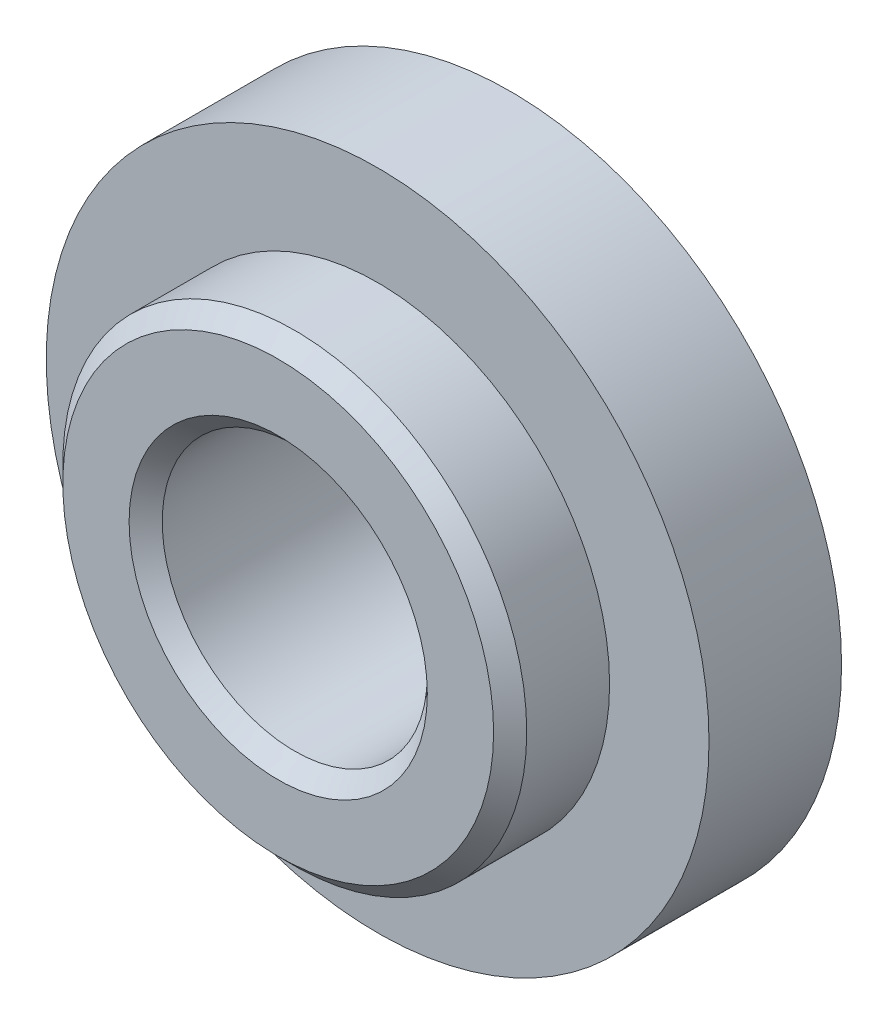
ISO-10303-21;
HEADER;
FILE_DESCRIPTION(('STEP AP214'),'2;1');
FILE_NAME('part.step','',(''),(''),'','','');
FILE_SCHEMA(('AUTOMOTIVE_DESIGN { 1 0 10303 214 1 1 1 1 }'));
ENDSEC;
DATA;
#1=APPLICATION_CONTEXT('core data for automotive mechanical design processes');
#2=APPLICATION_PROTOCOL_DEFINITION('international standard','automotive_design',2000,#1);
#3=PRODUCT_CONTEXT('',#1,'mechanical');
#4=PRODUCT('Part','Part','',(#3));
#5=PRODUCT_RELATED_PRODUCT_CATEGORY('part','',(#4));
#6=PRODUCT_DEFINITION_FORMATION('','',#4);
#7=PRODUCT_DEFINITION_CONTEXT('part definition',#1,'design');
#8=PRODUCT_DEFINITION('design','',#6,#7);
#9=PRODUCT_DEFINITION_SHAPE('','',#8);
#10=(LENGTH_UNIT() NAMED_UNIT(*) SI_UNIT(.MILLI.,.METRE.));
#11=(NAMED_UNIT(*) PLANE_ANGLE_UNIT() SI_UNIT($,.RADIAN.));
#12=(NAMED_UNIT(*) SI_UNIT($,.STERADIAN.) SOLID_ANGLE_UNIT());
#13=UNCERTAINTY_MEASURE_WITH_UNIT(LENGTH_MEASURE(1.E-05),#10,'distance_accuracy_value','');
#14=(GEOMETRIC_REPRESENTATION_CONTEXT(3) GLOBAL_UNCERTAINTY_ASSIGNED_CONTEXT((#13)) GLOBAL_UNIT_ASSIGNED_CONTEXT((#10,
#11,#12)) REPRESENTATION_CONTEXT('',''));
#15=CARTESIAN_POINT('',(0.,0.,0.));
#16=DIRECTION('',(0.,0.,1.));
#17=DIRECTION('',(1.,0.,0.));
#18=AXIS2_PLACEMENT_3D('',#15,#16,#17);
#19=CARTESIAN_POINT('',(0.,0.,4.));
#20=DIRECTION('',(0.,0.,1.));
#21=DIRECTION('',(1.,0.,0.));
#22=AXIS2_PLACEMENT_3D('',#19,#20,#21);
#23=PLANE('',#22);
#24=CARTESIAN_POINT('',(0.,0.,4.));
#25=DIRECTION('',(0.,0.,1.));
#26=DIRECTION('',(1.,0.,0.));
#27=AXIS2_PLACEMENT_3D('',#24,#25,#26);
#28=CIRCLE('',#27,7.);
#29=CARTESIAN_POINT('',(7.,0.,4.));
#30=VERTEX_POINT('',#29);
#31=EDGE_CURVE('E54',#30,#30,#28,.T.);
#32=ORIENTED_EDGE('',*,*,#31,.F.);
#33=EDGE_LOOP('',(#32));
#34=FACE_BOUND('',#33,.T.);
#35=CARTESIAN_POINT('',(0.,0.,4.));
#36=DIRECTION('',(0.,0.,1.));
#37=DIRECTION('',(1.,0.,0.));
#38=AXIS2_PLACEMENT_3D('',#35,#36,#37);
#39=CIRCLE('',#38,10.);
#40=CARTESIAN_POINT('',(10.,0.,4.));
#41=VERTEX_POINT('',#40);
#42=EDGE_CURVE('E55',#41,#41,#39,.T.);
#43=ORIENTED_EDGE('',*,*,#42,.T.);
#44=EDGE_LOOP('',(#43));
#45=FACE_BOUND('',#44,.T.);
#46=ADVANCED_FACE('F28',(#34,#45),#23,.T.);
#47=CARTESIAN_POINT('',(0.,0.,0.));
#48=DIRECTION('',(0.,0.,1.));
#49=DIRECTION('',(1.,0.,0.));
#50=AXIS2_PLACEMENT_3D('',#47,#48,#49);
#51=PLANE('',#50);
#52=CARTESIAN_POINT('',(0.,0.,0.));
#53=DIRECTION('',(0.,0.,1.));
#54=DIRECTION('',(1.,0.,0.));
#55=AXIS2_PLACEMENT_3D('',#52,#53,#54);
#56=CIRCLE('',#55,4.50000000000001);
#57=CARTESIAN_POINT('',(4.50000000000001,0.,0.));
#58=VERTEX_POINT('',#57);
#59=EDGE_CURVE('E10',#58,#58,#56,.T.);
#60=ORIENTED_EDGE('',*,*,#59,.T.);
#61=EDGE_LOOP('',(#60));
#62=FACE_BOUND('',#61,.T.);
#63=CARTESIAN_POINT('',(0.,0.,0.));
#64=DIRECTION('',(0.,0.,1.));
#65=DIRECTION('',(1.,0.,0.));
#66=AXIS2_PLACEMENT_3D('',#63,#64,#65);
#67=CIRCLE('',#66,10.);
#68=CARTESIAN_POINT('',(10.,0.,0.));
#69=VERTEX_POINT('',#68);
#70=EDGE_CURVE('E58',#69,#69,#67,.T.);
#71=ORIENTED_EDGE('',*,*,#70,.F.);
#72=EDGE_LOOP('',(#71));
#73=FACE_BOUND('',#72,.T.);
#74=ADVANCED_FACE('F68',(#62,#73),#51,.F.);
#75=CARTESIAN_POINT('',(0.,0.,4.));
#76=DIRECTION('',(0.,0.,-1.));
#77=DIRECTION('',(-1.,0.,0.));
#78=AXIS2_PLACEMENT_3D('',#75,#76,#77);
#79=CYLINDRICAL_SURFACE('',#78,10.);
#80=ORIENTED_EDGE('',*,*,#42,.F.);
#81=EDGE_LOOP('',(#80));
#82=FACE_BOUND('',#81,.T.);
#83=ORIENTED_EDGE('',*,*,#70,.T.);
#84=EDGE_LOOP('',(#83));
#85=FACE_BOUND('',#84,.T.);
#86=ADVANCED_FACE('F30',(#82,#85),#79,.T.);
#87=CARTESIAN_POINT('',(0.,0.,4.));
#88=DIRECTION('',(0.,0.,-1.));
#89=DIRECTION('',(-1.,0.,0.));
#90=AXIS2_PLACEMENT_3D('',#87,#88,#89);
#91=CYLINDRICAL_SURFACE('',#90,4.);
#92=CARTESIAN_POINT('',(0.,0.,6.49999999999999));
#93=DIRECTION('',(0.,0.,1.));
#94=DIRECTION('',(1.,0.,0.));
#95=AXIS2_PLACEMENT_3D('',#92,#93,#94);
#96=CIRCLE('',#95,4.);
#97=CARTESIAN_POINT('',(4.,0.,6.49999999999999));
#98=VERTEX_POINT('',#97);
#99=EDGE_CURVE('E48',#98,#98,#96,.T.);
#100=ORIENTED_EDGE('',*,*,#99,.T.);
#101=EDGE_LOOP('',(#100));
#102=FACE_BOUND('',#101,.T.);
#103=CARTESIAN_POINT('',(0.,0.,0.500000000000003));
#104=DIRECTION('',(0.,0.,1.));
#105=DIRECTION('',(1.,0.,0.));
#106=AXIS2_PLACEMENT_3D('',#103,#104,#105);
#107=CIRCLE('',#106,4.);
#108=CARTESIAN_POINT('',(4.,0.,0.500000000000003));
#109=VERTEX_POINT('',#108);
#110=EDGE_CURVE('E51',#109,#109,#107,.F.);
#111=ORIENTED_EDGE('',*,*,#110,.T.);
#112=EDGE_LOOP('',(#111));
#113=FACE_BOUND('',#112,.T.);
#114=ADVANCED_FACE('F73',(#102,#113),#91,.F.);
#115=CARTESIAN_POINT('',(0.,0.,7.));
#116=DIRECTION('',(0.,0.,1.));
#117=DIRECTION('',(1.,0.,0.));
#118=AXIS2_PLACEMENT_3D('',#115,#116,#117);
#119=PLANE('',#118);
#120=CARTESIAN_POINT('',(0.,0.,7.));
#121=DIRECTION('',(0.,0.,1.));
#122=DIRECTION('',(1.,0.,0.));
#123=AXIS2_PLACEMENT_3D('',#120,#121,#122);
#124=CIRCLE('',#123,4.5);
#125=CARTESIAN_POINT('',(4.5,0.,7.));
#126=VERTEX_POINT('',#125);
#127=EDGE_CURVE('E39',#126,#126,#124,.F.);
#128=ORIENTED_EDGE('',*,*,#127,.T.);
#129=EDGE_LOOP('',(#128));
#130=FACE_BOUND('',#129,.T.);
#131=CARTESIAN_POINT('',(0.,0.,7.));
#132=DIRECTION('',(0.,0.,1.));
#133=DIRECTION('',(1.,0.,0.));
#134=AXIS2_PLACEMENT_3D('',#131,#132,#133);
#135=CIRCLE('',#134,6.49999999999999);
#136=CARTESIAN_POINT('',(6.49999999999999,0.,7.));
#137=VERTEX_POINT('',#136);
#138=EDGE_CURVE('E43',#137,#137,#135,.T.);
#139=ORIENTED_EDGE('',*,*,#138,.T.);
#140=EDGE_LOOP('',(#139));
#141=FACE_BOUND('',#140,.T.);
#142=ADVANCED_FACE('F83',(#130,#141),#119,.T.);
#143=CARTESIAN_POINT('',(0.,0.,7.));
#144=DIRECTION('',(0.,0.,-1.));
#145=DIRECTION('',(-1.,0.,0.));
#146=AXIS2_PLACEMENT_3D('',#143,#144,#145);
#147=CYLINDRICAL_SURFACE('',#146,7.);
#148=CARTESIAN_POINT('',(0.,0.,6.5));
#149=DIRECTION('',(0.,0.,1.));
#150=DIRECTION('',(1.,0.,0.));
#151=AXIS2_PLACEMENT_3D('',#148,#149,#150);
#152=CIRCLE('',#151,7.);
#153=CARTESIAN_POINT('',(7.,0.,6.5));
#154=VERTEX_POINT('',#153);
#155=EDGE_CURVE('E35',#154,#154,#152,.F.);
#156=ORIENTED_EDGE('',*,*,#155,.T.);
#157=EDGE_LOOP('',(#156));
#158=FACE_BOUND('',#157,.T.);
#159=ORIENTED_EDGE('',*,*,#31,.T.);
#160=EDGE_LOOP('',(#159));
#161=FACE_BOUND('',#160,.T.);
#162=ADVANCED_FACE('F64',(#158,#161),#147,.T.);
#163=CARTESIAN_POINT('',(0.,0.,6.49999999999999));
#164=DIRECTION('',(0.,0.,1.));
#165=DIRECTION('',(1.,0.,0.));
#166=AXIS2_PLACEMENT_3D('',#163,#164,#165);
#167=CONICAL_SURFACE('',#166,4.,0.785398163397443);
#168=ORIENTED_EDGE('',*,*,#127,.F.);
#169=EDGE_LOOP('',(#168));
#170=FACE_BOUND('',#169,.T.);
#171=ORIENTED_EDGE('',*,*,#99,.F.);
#172=EDGE_LOOP('',(#171));
#173=FACE_BOUND('',#172,.T.);
#174=ADVANCED_FACE('F87',(#170,#173),#167,.F.);
#175=CARTESIAN_POINT('',(0.,0.,7.));
#176=DIRECTION('',(0.,0.,-1.));
#177=DIRECTION('',(-1.,0.,0.));
#178=AXIS2_PLACEMENT_3D('',#175,#176,#177);
#179=CONICAL_SURFACE('',#178,6.49999999999999,0.785398163397453);
#180=ORIENTED_EDGE('',*,*,#155,.F.);
#181=EDGE_LOOP('',(#180));
#182=FACE_BOUND('',#181,.T.);
#183=ORIENTED_EDGE('',*,*,#138,.F.);
#184=EDGE_LOOP('',(#183));
#185=FACE_BOUND('',#184,.T.);
#186=ADVANCED_FACE('F93',(#182,#185),#179,.T.);
#187=CARTESIAN_POINT('',(0.,0.,0.));
#188=DIRECTION('',(0.,0.,-1.));
#189=DIRECTION('',(-1.,0.,0.));
#190=AXIS2_PLACEMENT_3D('',#187,#188,#189);
#191=CONICAL_SURFACE('',#190,4.50000000000001,0.785398163397454);
#192=ORIENTED_EDGE('',*,*,#110,.F.);
#193=EDGE_LOOP('',(#192));
#194=FACE_BOUND('',#193,.T.);
#195=ORIENTED_EDGE('',*,*,#59,.F.);
#196=EDGE_LOOP('',(#195));
#197=FACE_BOUND('',#196,.T.);
#198=ADVANCED_FACE('F97',(#194,#197),#191,.F.);
#199=CLOSED_SHELL('',(#46,#74,#86,#114,#142,#162,#174,#186,#198));
#200=MANIFOLD_SOLID_BREP('B2',#199);
#201=ADVANCED_BREP_SHAPE_REPRESENTATION('',(#18,#200),#14);
#202=SHAPE_DEFINITION_REPRESENTATION(#9,#201);
ENDSEC;
END-ISO-10303-21;
